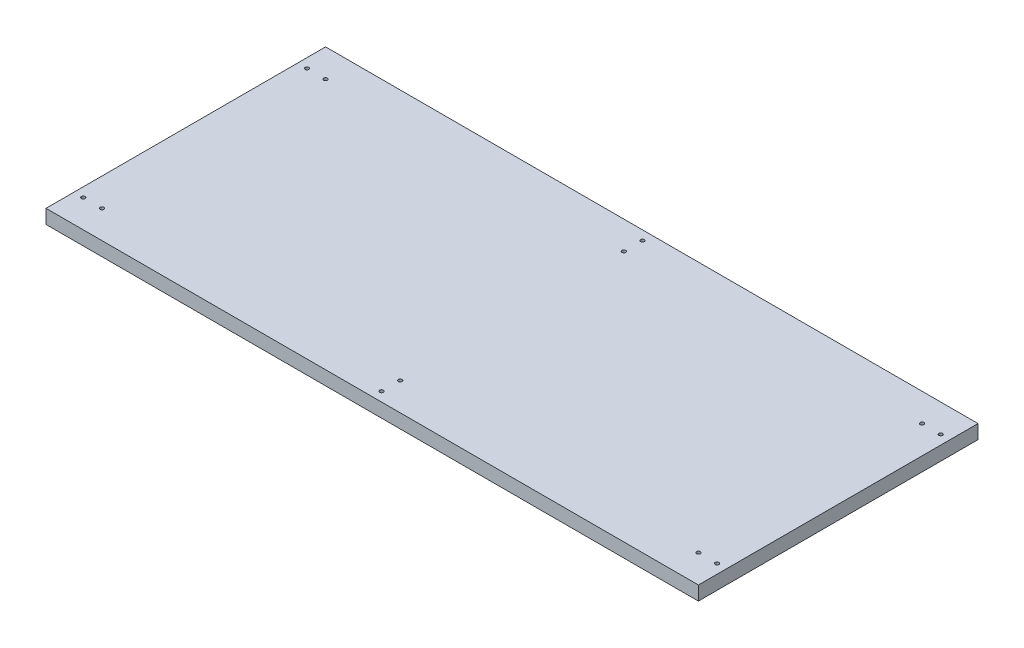
ISO-10303-21;
HEADER;
FILE_DESCRIPTION(('STEP AP214'),'2;1');
FILE_NAME('part.step','',(''),(''),'','','');
FILE_SCHEMA(('AUTOMOTIVE_DESIGN { 1 0 10303 214 1 1 1 1 }'));
ENDSEC;
DATA;
#1=APPLICATION_CONTEXT('core data for automotive mechanical design processes');
#2=APPLICATION_PROTOCOL_DEFINITION('international standard','automotive_design',2000,#1);
#3=PRODUCT_CONTEXT('',#1,'mechanical');
#4=PRODUCT('Part','Part','',(#3));
#5=PRODUCT_RELATED_PRODUCT_CATEGORY('part','',(#4));
#6=PRODUCT_DEFINITION_FORMATION('','',#4);
#7=PRODUCT_DEFINITION_CONTEXT('part definition',#1,'design');
#8=PRODUCT_DEFINITION('design','',#6,#7);
#9=PRODUCT_DEFINITION_SHAPE('','',#8);
#10=(LENGTH_UNIT() NAMED_UNIT(*) SI_UNIT(.MILLI.,.METRE.));
#11=(NAMED_UNIT(*) PLANE_ANGLE_UNIT() SI_UNIT($,.RADIAN.));
#12=(NAMED_UNIT(*) SI_UNIT($,.STERADIAN.) SOLID_ANGLE_UNIT());
#13=UNCERTAINTY_MEASURE_WITH_UNIT(LENGTH_MEASURE(1.E-05),#10,'distance_accuracy_value','');
#14=(GEOMETRIC_REPRESENTATION_CONTEXT(3) GLOBAL_UNCERTAINTY_ASSIGNED_CONTEXT((#13)) GLOBAL_UNIT_ASSIGNED_CONTEXT((#10,
#11,#12)) REPRESENTATION_CONTEXT('',''));
#15=CARTESIAN_POINT('',(0.,0.,0.));
#16=DIRECTION('',(0.,0.,1.));
#17=DIRECTION('',(1.,0.,0.));
#18=AXIS2_PLACEMENT_3D('',#15,#16,#17);
#19=CARTESIAN_POINT('',(350.,15.,150.));
#20=DIRECTION('',(-1.,0.,0.));
#21=DIRECTION('',(0.,0.,1.));
#22=AXIS2_PLACEMENT_3D('',#19,#20,#21);
#23=PLANE('',#22);
#24=DIRECTION('',(0.,0.,-1.));
#25=VECTOR('',#24,1.);
#26=CARTESIAN_POINT('',(350.,0.,150.));
#27=LINE('',#26,#25);
#28=CARTESIAN_POINT('',(350.,0.,150.));
#29=VERTEX_POINT('',#28);
#30=CARTESIAN_POINT('',(350.,0.,-150.));
#31=VERTEX_POINT('',#30);
#32=EDGE_CURVE('E96',#29,#31,#27,.T.);
#33=ORIENTED_EDGE('',*,*,#32,.T.);
#34=DIRECTION('',(0.,-1.,0.));
#35=VECTOR('',#34,1.);
#36=CARTESIAN_POINT('',(350.,15.,-150.));
#37=LINE('',#36,#35);
#38=CARTESIAN_POINT('',(350.,15.,-150.));
#39=VERTEX_POINT('',#38);
#40=EDGE_CURVE('E11',#39,#31,#37,.T.);
#41=ORIENTED_EDGE('',*,*,#40,.F.);
#42=DIRECTION('',(0.,0.,-1.));
#43=VECTOR('',#42,1.);
#44=CARTESIAN_POINT('',(350.,15.,150.));
#45=LINE('',#44,#43);
#46=CARTESIAN_POINT('',(350.,15.,150.));
#47=VERTEX_POINT('',#46);
#48=EDGE_CURVE('E84',#47,#39,#45,.T.);
#49=ORIENTED_EDGE('',*,*,#48,.F.);
#50=DIRECTION('',(0.,-1.,0.));
#51=VECTOR('',#50,1.);
#52=CARTESIAN_POINT('',(350.,15.,150.));
#53=LINE('',#52,#51);
#54=EDGE_CURVE('E92',#47,#29,#53,.T.);
#55=ORIENTED_EDGE('',*,*,#54,.T.);
#56=EDGE_LOOP('',(#33,#41,#49,#55));
#57=FACE_BOUND('',#56,.T.);
#58=ADVANCED_FACE('F33',(#57),#23,.F.);
#59=CARTESIAN_POINT('',(-350.,15.,-150.));
#60=DIRECTION('',(0.,0.,1.));
#61=DIRECTION('',(1.,0.,0.));
#62=AXIS2_PLACEMENT_3D('',#59,#60,#61);
#63=PLANE('',#62);
#64=DIRECTION('',(-1.,0.,0.));
#65=VECTOR('',#64,1.);
#66=CARTESIAN_POINT('',(-350.,0.,-150.));
#67=LINE('',#66,#65);
#68=CARTESIAN_POINT('',(-350.,0.,-150.));
#69=VERTEX_POINT('',#68);
#70=EDGE_CURVE('E88',#31,#69,#67,.T.);
#71=ORIENTED_EDGE('',*,*,#70,.T.);
#72=DIRECTION('',(0.,-1.,0.));
#73=VECTOR('',#72,1.);
#74=CARTESIAN_POINT('',(-350.,15.,-150.));
#75=LINE('',#74,#73);
#76=CARTESIAN_POINT('',(-350.,15.,-150.));
#77=VERTEX_POINT('',#76);
#78=EDGE_CURVE('E41',#77,#69,#75,.T.);
#79=ORIENTED_EDGE('',*,*,#78,.F.);
#80=DIRECTION('',(-1.,0.,0.));
#81=VECTOR('',#80,1.);
#82=CARTESIAN_POINT('',(-350.,15.,-150.));
#83=LINE('',#82,#81);
#84=EDGE_CURVE('E79',#39,#77,#83,.T.);
#85=ORIENTED_EDGE('',*,*,#84,.F.);
#86=ORIENTED_EDGE('',*,*,#40,.T.);
#87=EDGE_LOOP('',(#71,#79,#85,#86));
#88=FACE_BOUND('',#87,.T.);
#89=ADVANCED_FACE('F87',(#88),#63,.F.);
#90=CARTESIAN_POINT('',(-350.,15.,150.));
#91=DIRECTION('',(1.,0.,0.));
#92=DIRECTION('',(0.,0.,-1.));
#93=AXIS2_PLACEMENT_3D('',#90,#91,#92);
#94=PLANE('',#93);
#95=DIRECTION('',(0.,0.,1.));
#96=VECTOR('',#95,1.);
#97=CARTESIAN_POINT('',(-350.,0.,150.));
#98=LINE('',#97,#96);
#99=CARTESIAN_POINT('',(-350.,0.,150.));
#100=VERTEX_POINT('',#99);
#101=EDGE_CURVE('E66',#69,#100,#98,.T.);
#102=ORIENTED_EDGE('',*,*,#101,.T.);
#103=DIRECTION('',(0.,-1.,0.));
#104=VECTOR('',#103,1.);
#105=CARTESIAN_POINT('',(-350.,15.,150.));
#106=LINE('',#105,#104);
#107=CARTESIAN_POINT('',(-350.,15.,150.));
#108=VERTEX_POINT('',#107);
#109=EDGE_CURVE('E89',#108,#100,#106,.T.);
#110=ORIENTED_EDGE('',*,*,#109,.F.);
#111=DIRECTION('',(0.,0.,1.));
#112=VECTOR('',#111,1.);
#113=CARTESIAN_POINT('',(-350.,15.,150.));
#114=LINE('',#113,#112);
#115=EDGE_CURVE('E82',#77,#108,#114,.T.);
#116=ORIENTED_EDGE('',*,*,#115,.F.);
#117=ORIENTED_EDGE('',*,*,#78,.T.);
#118=EDGE_LOOP('',(#102,#110,#116,#117));
#119=FACE_BOUND('',#118,.T.);
#120=ADVANCED_FACE('F90',(#119),#94,.F.);
#121=CARTESIAN_POINT('',(-350.,15.,150.));
#122=DIRECTION('',(0.,0.,-1.));
#123=DIRECTION('',(-1.,0.,0.));
#124=AXIS2_PLACEMENT_3D('',#121,#122,#123);
#125=PLANE('',#124);
#126=DIRECTION('',(1.,0.,0.));
#127=VECTOR('',#126,1.);
#128=CARTESIAN_POINT('',(-350.,0.,150.));
#129=LINE('',#128,#127);
#130=EDGE_CURVE('E72',#100,#29,#129,.T.);
#131=ORIENTED_EDGE('',*,*,#130,.T.);
#132=ORIENTED_EDGE('',*,*,#54,.F.);
#133=DIRECTION('',(1.,0.,0.));
#134=VECTOR('',#133,1.);
#135=CARTESIAN_POINT('',(-350.,15.,150.));
#136=LINE('',#135,#134);
#137=EDGE_CURVE('E49',#108,#47,#136,.T.);
#138=ORIENTED_EDGE('',*,*,#137,.F.);
#139=ORIENTED_EDGE('',*,*,#109,.T.);
#140=EDGE_LOOP('',(#131,#132,#138,#139));
#141=FACE_BOUND('',#140,.T.);
#142=ADVANCED_FACE('F104',(#141),#125,.F.);
#143=CARTESIAN_POINT('',(0.,15.,0.));
#144=DIRECTION('',(0.,-1.,0.));
#145=DIRECTION('',(0.,0.,-1.));
#146=AXIS2_PLACEMENT_3D('',#143,#144,#145);
#147=PLANE('',#146);
#148=CARTESIAN_POINT('',(340.,15.,-120.));
#149=DIRECTION('',(0.,1.,0.));
#150=DIRECTION('',(0.,0.,1.));
#151=AXIS2_PLACEMENT_3D('',#148,#149,#150);
#152=CIRCLE('',#151,2.);
#153=CARTESIAN_POINT('',(340.,15.,-118.));
#154=VERTEX_POINT('',#153);
#155=EDGE_CURVE('E176',#154,#154,#152,.T.);
#156=ORIENTED_EDGE('',*,*,#155,.F.);
#157=EDGE_LOOP('',(#156));
#158=FACE_BOUND('',#157,.T.);
#159=CARTESIAN_POINT('',(340.,15.,120.));
#160=DIRECTION('',(0.,1.,0.));
#161=DIRECTION('',(0.,0.,1.));
#162=AXIS2_PLACEMENT_3D('',#159,#160,#161);
#163=CIRCLE('',#162,2.);
#164=CARTESIAN_POINT('',(340.,15.,122.));
#165=VERTEX_POINT('',#164);
#166=EDGE_CURVE('E170',#165,#165,#163,.T.);
#167=ORIENTED_EDGE('',*,*,#166,.F.);
#168=EDGE_LOOP('',(#167));
#169=FACE_BOUND('',#168,.T.);
#170=CARTESIAN_POINT('',(0.,15.,-140.));
#171=DIRECTION('',(0.,1.,0.));
#172=DIRECTION('',(0.,0.,1.));
#173=AXIS2_PLACEMENT_3D('',#170,#171,#172);
#174=CIRCLE('',#173,2.);
#175=CARTESIAN_POINT('',(0.,15.,-138.));
#176=VERTEX_POINT('',#175);
#177=EDGE_CURVE('E164',#176,#176,#174,.T.);
#178=ORIENTED_EDGE('',*,*,#177,.F.);
#179=EDGE_LOOP('',(#178));
#180=FACE_BOUND('',#179,.T.);
#181=CARTESIAN_POINT('',(0.,15.,140.));
#182=DIRECTION('',(0.,1.,0.));
#183=DIRECTION('',(0.,0.,1.));
#184=AXIS2_PLACEMENT_3D('',#181,#182,#183);
#185=CIRCLE('',#184,2.);
#186=CARTESIAN_POINT('',(0.,15.,142.));
#187=VERTEX_POINT('',#186);
#188=EDGE_CURVE('E158',#187,#187,#185,.T.);
#189=ORIENTED_EDGE('',*,*,#188,.F.);
#190=EDGE_LOOP('',(#189));
#191=FACE_BOUND('',#190,.T.);
#192=CARTESIAN_POINT('',(-340.,15.,-120.));
#193=DIRECTION('',(0.,1.,0.));
#194=DIRECTION('',(0.,0.,1.));
#195=AXIS2_PLACEMENT_3D('',#192,#193,#194);
#196=CIRCLE('',#195,2.);
#197=CARTESIAN_POINT('',(-340.,15.,-118.));
#198=VERTEX_POINT('',#197);
#199=EDGE_CURVE('E152',#198,#198,#196,.T.);
#200=ORIENTED_EDGE('',*,*,#199,.F.);
#201=EDGE_LOOP('',(#200));
#202=FACE_BOUND('',#201,.T.);
#203=CARTESIAN_POINT('',(-340.,15.,120.));
#204=DIRECTION('',(0.,1.,0.));
#205=DIRECTION('',(0.,0.,1.));
#206=AXIS2_PLACEMENT_3D('',#203,#204,#205);
#207=CIRCLE('',#206,2.);
#208=CARTESIAN_POINT('',(-340.,15.,122.));
#209=VERTEX_POINT('',#208);
#210=EDGE_CURVE('E146',#209,#209,#207,.T.);
#211=ORIENTED_EDGE('',*,*,#210,.F.);
#212=EDGE_LOOP('',(#211));
#213=FACE_BOUND('',#212,.T.);
#214=CARTESIAN_POINT('',(0.,15.,-120.));
#215=DIRECTION('',(0.,1.,0.));
#216=DIRECTION('',(0.,0.,1.));
#217=AXIS2_PLACEMENT_3D('',#214,#215,#216);
#218=CIRCLE('',#217,2.);
#219=CARTESIAN_POINT('',(0.,15.,-118.));
#220=VERTEX_POINT('',#219);
#221=EDGE_CURVE('E140',#220,#220,#218,.T.);
#222=ORIENTED_EDGE('',*,*,#221,.F.);
#223=EDGE_LOOP('',(#222));
#224=FACE_BOUND('',#223,.T.);
#225=CARTESIAN_POINT('',(0.,15.,120.));
#226=DIRECTION('',(0.,1.,0.));
#227=DIRECTION('',(0.,0.,1.));
#228=AXIS2_PLACEMENT_3D('',#225,#226,#227);
#229=CIRCLE('',#228,2.);
#230=CARTESIAN_POINT('',(0.,15.,122.));
#231=VERTEX_POINT('',#230);
#232=EDGE_CURVE('E134',#231,#231,#229,.T.);
#233=ORIENTED_EDGE('',*,*,#232,.F.);
#234=EDGE_LOOP('',(#233));
#235=FACE_BOUND('',#234,.T.);
#236=CARTESIAN_POINT('',(320.,15.,120.));
#237=DIRECTION('',(0.,1.,0.));
#238=DIRECTION('',(0.,0.,1.));
#239=AXIS2_PLACEMENT_3D('',#236,#237,#238);
#240=CIRCLE('',#239,2.);
#241=CARTESIAN_POINT('',(320.,15.,122.));
#242=VERTEX_POINT('',#241);
#243=EDGE_CURVE('E128',#242,#242,#240,.T.);
#244=ORIENTED_EDGE('',*,*,#243,.F.);
#245=EDGE_LOOP('',(#244));
#246=FACE_BOUND('',#245,.T.);
#247=CARTESIAN_POINT('',(320.,15.,-120.));
#248=DIRECTION('',(0.,1.,0.));
#249=DIRECTION('',(0.,0.,1.));
#250=AXIS2_PLACEMENT_3D('',#247,#248,#249);
#251=CIRCLE('',#250,2.);
#252=CARTESIAN_POINT('',(320.,15.,-118.));
#253=VERTEX_POINT('',#252);
#254=EDGE_CURVE('E122',#253,#253,#251,.T.);
#255=ORIENTED_EDGE('',*,*,#254,.F.);
#256=EDGE_LOOP('',(#255));
#257=FACE_BOUND('',#256,.T.);
#258=CARTESIAN_POINT('',(-320.,15.,120.));
#259=DIRECTION('',(0.,1.,0.));
#260=DIRECTION('',(0.,0.,1.));
#261=AXIS2_PLACEMENT_3D('',#258,#259,#260);
#262=CIRCLE('',#261,2.);
#263=CARTESIAN_POINT('',(-320.,15.,122.));
#264=VERTEX_POINT('',#263);
#265=EDGE_CURVE('E116',#264,#264,#262,.T.);
#266=ORIENTED_EDGE('',*,*,#265,.F.);
#267=EDGE_LOOP('',(#266));
#268=FACE_BOUND('',#267,.T.);
#269=CARTESIAN_POINT('',(-320.,15.,-120.));
#270=DIRECTION('',(0.,1.,0.));
#271=DIRECTION('',(0.,0.,1.));
#272=AXIS2_PLACEMENT_3D('',#269,#270,#271);
#273=CIRCLE('',#272,2.);
#274=CARTESIAN_POINT('',(-320.,15.,-118.));
#275=VERTEX_POINT('',#274);
#276=EDGE_CURVE('E110',#275,#275,#273,.T.);
#277=ORIENTED_EDGE('',*,*,#276,.F.);
#278=EDGE_LOOP('',(#277));
#279=FACE_BOUND('',#278,.T.);
#280=ORIENTED_EDGE('',*,*,#48,.T.);
#281=ORIENTED_EDGE('',*,*,#84,.T.);
#282=ORIENTED_EDGE('',*,*,#115,.T.);
#283=ORIENTED_EDGE('',*,*,#137,.T.);
#284=EDGE_LOOP('',(#280,#281,#282,#283));
#285=FACE_BOUND('',#284,.T.);
#286=ADVANCED_FACE('F80',(#158,#169,#180,#191,#202,#213,#224,#235,#246,#257,#268,#279,#285),
#147,.F.);
#287=CARTESIAN_POINT('',(0.,0.,0.));
#288=DIRECTION('',(0.,-1.,0.));
#289=DIRECTION('',(0.,0.,-1.));
#290=AXIS2_PLACEMENT_3D('',#287,#288,#289);
#291=PLANE('',#290);
#292=ORIENTED_EDGE('',*,*,#32,.F.);
#293=ORIENTED_EDGE('',*,*,#130,.F.);
#294=ORIENTED_EDGE('',*,*,#101,.F.);
#295=ORIENTED_EDGE('',*,*,#70,.F.);
#296=EDGE_LOOP('',(#292,#293,#294,#295));
#297=FACE_BOUND('',#296,.T.);
#298=ADVANCED_FACE('F107',(#297),#291,.T.);
#299=CARTESIAN_POINT('',(-320.,5.,-120.));
#300=DIRECTION('',(0.,1.,0.));
#301=DIRECTION('',(0.,0.,1.));
#302=AXIS2_PLACEMENT_3D('',#299,#300,#301);
#303=CYLINDRICAL_SURFACE('',#302,2.);
#304=CARTESIAN_POINT('',(-320.,5.,-120.));
#305=DIRECTION('',(0.,1.,0.));
#306=DIRECTION('',(0.,0.,1.));
#307=AXIS2_PLACEMENT_3D('',#304,#305,#306);
#308=CIRCLE('',#307,2.);
#309=CARTESIAN_POINT('',(-320.,5.,-118.));
#310=VERTEX_POINT('',#309);
#311=EDGE_CURVE('E99',#310,#310,#308,.T.);
#312=ORIENTED_EDGE('',*,*,#311,.F.);
#313=EDGE_LOOP('',(#312));
#314=FACE_BOUND('',#313,.T.);
#315=ORIENTED_EDGE('',*,*,#276,.T.);
#316=EDGE_LOOP('',(#315));
#317=FACE_BOUND('',#316,.T.);
#318=ADVANCED_FACE('F216',(#314,#317),#303,.F.);
#319=CARTESIAN_POINT('',(-320.,5.,-120.));
#320=DIRECTION('',(0.,1.,0.));
#321=DIRECTION('',(0.,0.,1.));
#322=AXIS2_PLACEMENT_3D('',#319,#320,#321);
#323=PLANE('',#322);
#324=ORIENTED_EDGE('',*,*,#311,.T.);
#325=EDGE_LOOP('',(#324));
#326=FACE_BOUND('',#325,.T.);
#327=ADVANCED_FACE('F218',(#326),#323,.T.);
#328=CARTESIAN_POINT('',(-320.,5.,120.));
#329=DIRECTION('',(0.,1.,0.));
#330=DIRECTION('',(0.,0.,1.));
#331=AXIS2_PLACEMENT_3D('',#328,#329,#330);
#332=CYLINDRICAL_SURFACE('',#331,2.);
#333=CARTESIAN_POINT('',(-320.,5.,120.));
#334=DIRECTION('',(0.,1.,0.));
#335=DIRECTION('',(0.,0.,1.));
#336=AXIS2_PLACEMENT_3D('',#333,#334,#335);
#337=CIRCLE('',#336,2.);
#338=CARTESIAN_POINT('',(-320.,5.,122.));
#339=VERTEX_POINT('',#338);
#340=EDGE_CURVE('E113',#339,#339,#337,.T.);
#341=ORIENTED_EDGE('',*,*,#340,.F.);
#342=EDGE_LOOP('',(#341));
#343=FACE_BOUND('',#342,.T.);
#344=ORIENTED_EDGE('',*,*,#265,.T.);
#345=EDGE_LOOP('',(#344));
#346=FACE_BOUND('',#345,.T.);
#347=ADVANCED_FACE('F225',(#343,#346),#332,.F.);
#348=CARTESIAN_POINT('',(-320.,5.,120.));
#349=DIRECTION('',(0.,1.,0.));
#350=DIRECTION('',(0.,0.,1.));
#351=AXIS2_PLACEMENT_3D('',#348,#349,#350);
#352=PLANE('',#351);
#353=ORIENTED_EDGE('',*,*,#340,.T.);
#354=EDGE_LOOP('',(#353));
#355=FACE_BOUND('',#354,.T.);
#356=ADVANCED_FACE('F273',(#355),#352,.T.);
#357=CARTESIAN_POINT('',(320.,5.,-120.));
#358=DIRECTION('',(0.,1.,0.));
#359=DIRECTION('',(0.,0.,1.));
#360=AXIS2_PLACEMENT_3D('',#357,#358,#359);
#361=CYLINDRICAL_SURFACE('',#360,2.);
#362=CARTESIAN_POINT('',(320.,5.,-120.));
#363=DIRECTION('',(0.,1.,0.));
#364=DIRECTION('',(0.,0.,1.));
#365=AXIS2_PLACEMENT_3D('',#362,#363,#364);
#366=CIRCLE('',#365,2.);
#367=CARTESIAN_POINT('',(320.,5.,-118.));
#368=VERTEX_POINT('',#367);
#369=EDGE_CURVE('E119',#368,#368,#366,.T.);
#370=ORIENTED_EDGE('',*,*,#369,.F.);
#371=EDGE_LOOP('',(#370));
#372=FACE_BOUND('',#371,.T.);
#373=ORIENTED_EDGE('',*,*,#254,.T.);
#374=EDGE_LOOP('',(#373));
#375=FACE_BOUND('',#374,.T.);
#376=ADVANCED_FACE('F282',(#372,#375),#361,.F.);
#377=CARTESIAN_POINT('',(320.,5.,-120.));
#378=DIRECTION('',(0.,1.,0.));
#379=DIRECTION('',(0.,0.,1.));
#380=AXIS2_PLACEMENT_3D('',#377,#378,#379);
#381=PLANE('',#380);
#382=ORIENTED_EDGE('',*,*,#369,.T.);
#383=EDGE_LOOP('',(#382));
#384=FACE_BOUND('',#383,.T.);
#385=ADVANCED_FACE('F291',(#384),#381,.T.);
#386=CARTESIAN_POINT('',(320.,5.,120.));
#387=DIRECTION('',(0.,1.,0.));
#388=DIRECTION('',(0.,0.,1.));
#389=AXIS2_PLACEMENT_3D('',#386,#387,#388);
#390=CYLINDRICAL_SURFACE('',#389,2.);
#391=CARTESIAN_POINT('',(320.,5.,120.));
#392=DIRECTION('',(0.,1.,0.));
#393=DIRECTION('',(0.,0.,1.));
#394=AXIS2_PLACEMENT_3D('',#391,#392,#393);
#395=CIRCLE('',#394,2.);
#396=CARTESIAN_POINT('',(320.,5.,122.));
#397=VERTEX_POINT('',#396);
#398=EDGE_CURVE('E125',#397,#397,#395,.T.);
#399=ORIENTED_EDGE('',*,*,#398,.F.);
#400=EDGE_LOOP('',(#399));
#401=FACE_BOUND('',#400,.T.);
#402=ORIENTED_EDGE('',*,*,#243,.T.);
#403=EDGE_LOOP('',(#402));
#404=FACE_BOUND('',#403,.T.);
#405=ADVANCED_FACE('F300',(#401,#404),#390,.F.);
#406=CARTESIAN_POINT('',(320.,5.,120.));
#407=DIRECTION('',(0.,1.,0.));
#408=DIRECTION('',(0.,0.,1.));
#409=AXIS2_PLACEMENT_3D('',#406,#407,#408);
#410=PLANE('',#409);
#411=ORIENTED_EDGE('',*,*,#398,.T.);
#412=EDGE_LOOP('',(#411));
#413=FACE_BOUND('',#412,.T.);
#414=ADVANCED_FACE('F309',(#413),#410,.T.);
#415=CARTESIAN_POINT('',(0.,5.,120.));
#416=DIRECTION('',(0.,1.,0.));
#417=DIRECTION('',(0.,0.,1.));
#418=AXIS2_PLACEMENT_3D('',#415,#416,#417);
#419=CYLINDRICAL_SURFACE('',#418,2.);
#420=CARTESIAN_POINT('',(0.,5.,120.));
#421=DIRECTION('',(0.,1.,0.));
#422=DIRECTION('',(0.,0.,1.));
#423=AXIS2_PLACEMENT_3D('',#420,#421,#422);
#424=CIRCLE('',#423,2.);
#425=CARTESIAN_POINT('',(0.,5.,122.));
#426=VERTEX_POINT('',#425);
#427=EDGE_CURVE('E131',#426,#426,#424,.T.);
#428=ORIENTED_EDGE('',*,*,#427,.F.);
#429=EDGE_LOOP('',(#428));
#430=FACE_BOUND('',#429,.T.);
#431=ORIENTED_EDGE('',*,*,#232,.T.);
#432=EDGE_LOOP('',(#431));
#433=FACE_BOUND('',#432,.T.);
#434=ADVANCED_FACE('F318',(#430,#433),#419,.F.);
#435=CARTESIAN_POINT('',(0.,5.,120.));
#436=DIRECTION('',(0.,1.,0.));
#437=DIRECTION('',(0.,0.,1.));
#438=AXIS2_PLACEMENT_3D('',#435,#436,#437);
#439=PLANE('',#438);
#440=ORIENTED_EDGE('',*,*,#427,.T.);
#441=EDGE_LOOP('',(#440));
#442=FACE_BOUND('',#441,.T.);
#443=ADVANCED_FACE('F327',(#442),#439,.T.);
#444=CARTESIAN_POINT('',(0.,5.,-120.));
#445=DIRECTION('',(0.,1.,0.));
#446=DIRECTION('',(0.,0.,1.));
#447=AXIS2_PLACEMENT_3D('',#444,#445,#446);
#448=CYLINDRICAL_SURFACE('',#447,2.);
#449=CARTESIAN_POINT('',(0.,5.,-120.));
#450=DIRECTION('',(0.,1.,0.));
#451=DIRECTION('',(0.,0.,1.));
#452=AXIS2_PLACEMENT_3D('',#449,#450,#451);
#453=CIRCLE('',#452,2.);
#454=CARTESIAN_POINT('',(0.,5.,-118.));
#455=VERTEX_POINT('',#454);
#456=EDGE_CURVE('E137',#455,#455,#453,.T.);
#457=ORIENTED_EDGE('',*,*,#456,.F.);
#458=EDGE_LOOP('',(#457));
#459=FACE_BOUND('',#458,.T.);
#460=ORIENTED_EDGE('',*,*,#221,.T.);
#461=EDGE_LOOP('',(#460));
#462=FACE_BOUND('',#461,.T.);
#463=ADVANCED_FACE('F336',(#459,#462),#448,.F.);
#464=CARTESIAN_POINT('',(0.,5.,-120.));
#465=DIRECTION('',(0.,1.,0.));
#466=DIRECTION('',(0.,0.,1.));
#467=AXIS2_PLACEMENT_3D('',#464,#465,#466);
#468=PLANE('',#467);
#469=ORIENTED_EDGE('',*,*,#456,.T.);
#470=EDGE_LOOP('',(#469));
#471=FACE_BOUND('',#470,.T.);
#472=ADVANCED_FACE('F345',(#471),#468,.T.);
#473=CARTESIAN_POINT('',(-340.,5.,120.));
#474=DIRECTION('',(0.,1.,0.));
#475=DIRECTION('',(0.,0.,1.));
#476=AXIS2_PLACEMENT_3D('',#473,#474,#475);
#477=CYLINDRICAL_SURFACE('',#476,2.);
#478=CARTESIAN_POINT('',(-340.,5.,120.));
#479=DIRECTION('',(0.,1.,0.));
#480=DIRECTION('',(0.,0.,1.));
#481=AXIS2_PLACEMENT_3D('',#478,#479,#480);
#482=CIRCLE('',#481,2.);
#483=CARTESIAN_POINT('',(-340.,5.,122.));
#484=VERTEX_POINT('',#483);
#485=EDGE_CURVE('E143',#484,#484,#482,.T.);
#486=ORIENTED_EDGE('',*,*,#485,.F.);
#487=EDGE_LOOP('',(#486));
#488=FACE_BOUND('',#487,.T.);
#489=ORIENTED_EDGE('',*,*,#210,.T.);
#490=EDGE_LOOP('',(#489));
#491=FACE_BOUND('',#490,.T.);
#492=ADVANCED_FACE('F354',(#488,#491),#477,.F.);
#493=CARTESIAN_POINT('',(-340.,5.,120.));
#494=DIRECTION('',(0.,1.,0.));
#495=DIRECTION('',(0.,0.,1.));
#496=AXIS2_PLACEMENT_3D('',#493,#494,#495);
#497=PLANE('',#496);
#498=ORIENTED_EDGE('',*,*,#485,.T.);
#499=EDGE_LOOP('',(#498));
#500=FACE_BOUND('',#499,.T.);
#501=ADVANCED_FACE('F363',(#500),#497,.T.);
#502=CARTESIAN_POINT('',(-340.,5.,-120.));
#503=DIRECTION('',(0.,1.,0.));
#504=DIRECTION('',(0.,0.,1.));
#505=AXIS2_PLACEMENT_3D('',#502,#503,#504);
#506=CYLINDRICAL_SURFACE('',#505,2.);
#507=CARTESIAN_POINT('',(-340.,5.,-120.));
#508=DIRECTION('',(0.,1.,0.));
#509=DIRECTION('',(0.,0.,1.));
#510=AXIS2_PLACEMENT_3D('',#507,#508,#509);
#511=CIRCLE('',#510,2.);
#512=CARTESIAN_POINT('',(-340.,5.,-118.));
#513=VERTEX_POINT('',#512);
#514=EDGE_CURVE('E149',#513,#513,#511,.T.);
#515=ORIENTED_EDGE('',*,*,#514,.F.);
#516=EDGE_LOOP('',(#515));
#517=FACE_BOUND('',#516,.T.);
#518=ORIENTED_EDGE('',*,*,#199,.T.);
#519=EDGE_LOOP('',(#518));
#520=FACE_BOUND('',#519,.T.);
#521=ADVANCED_FACE('F372',(#517,#520),#506,.F.);
#522=CARTESIAN_POINT('',(-340.,5.,-120.));
#523=DIRECTION('',(0.,1.,0.));
#524=DIRECTION('',(0.,0.,1.));
#525=AXIS2_PLACEMENT_3D('',#522,#523,#524);
#526=PLANE('',#525);
#527=ORIENTED_EDGE('',*,*,#514,.T.);
#528=EDGE_LOOP('',(#527));
#529=FACE_BOUND('',#528,.T.);
#530=ADVANCED_FACE('F381',(#529),#526,.T.);
#531=CARTESIAN_POINT('',(0.,5.,140.));
#532=DIRECTION('',(0.,1.,0.));
#533=DIRECTION('',(0.,0.,1.));
#534=AXIS2_PLACEMENT_3D('',#531,#532,#533);
#535=CYLINDRICAL_SURFACE('',#534,2.);
#536=CARTESIAN_POINT('',(0.,5.,140.));
#537=DIRECTION('',(0.,1.,0.));
#538=DIRECTION('',(0.,0.,1.));
#539=AXIS2_PLACEMENT_3D('',#536,#537,#538);
#540=CIRCLE('',#539,2.);
#541=CARTESIAN_POINT('',(0.,5.,142.));
#542=VERTEX_POINT('',#541);
#543=EDGE_CURVE('E155',#542,#542,#540,.T.);
#544=ORIENTED_EDGE('',*,*,#543,.F.);
#545=EDGE_LOOP('',(#544));
#546=FACE_BOUND('',#545,.T.);
#547=ORIENTED_EDGE('',*,*,#188,.T.);
#548=EDGE_LOOP('',(#547));
#549=FACE_BOUND('',#548,.T.);
#550=ADVANCED_FACE('F390',(#546,#549),#535,.F.);
#551=CARTESIAN_POINT('',(0.,5.,140.));
#552=DIRECTION('',(0.,1.,0.));
#553=DIRECTION('',(0.,0.,1.));
#554=AXIS2_PLACEMENT_3D('',#551,#552,#553);
#555=PLANE('',#554);
#556=ORIENTED_EDGE('',*,*,#543,.T.);
#557=EDGE_LOOP('',(#556));
#558=FACE_BOUND('',#557,.T.);
#559=ADVANCED_FACE('F399',(#558),#555,.T.);
#560=CARTESIAN_POINT('',(0.,5.,-140.));
#561=DIRECTION('',(0.,1.,0.));
#562=DIRECTION('',(0.,0.,1.));
#563=AXIS2_PLACEMENT_3D('',#560,#561,#562);
#564=CYLINDRICAL_SURFACE('',#563,2.);
#565=CARTESIAN_POINT('',(0.,5.,-140.));
#566=DIRECTION('',(0.,1.,0.));
#567=DIRECTION('',(0.,0.,1.));
#568=AXIS2_PLACEMENT_3D('',#565,#566,#567);
#569=CIRCLE('',#568,2.);
#570=CARTESIAN_POINT('',(0.,5.,-138.));
#571=VERTEX_POINT('',#570);
#572=EDGE_CURVE('E161',#571,#571,#569,.T.);
#573=ORIENTED_EDGE('',*,*,#572,.F.);
#574=EDGE_LOOP('',(#573));
#575=FACE_BOUND('',#574,.T.);
#576=ORIENTED_EDGE('',*,*,#177,.T.);
#577=EDGE_LOOP('',(#576));
#578=FACE_BOUND('',#577,.T.);
#579=ADVANCED_FACE('F408',(#575,#578),#564,.F.);
#580=CARTESIAN_POINT('',(0.,5.,-140.));
#581=DIRECTION('',(0.,1.,0.));
#582=DIRECTION('',(0.,0.,1.));
#583=AXIS2_PLACEMENT_3D('',#580,#581,#582);
#584=PLANE('',#583);
#585=ORIENTED_EDGE('',*,*,#572,.T.);
#586=EDGE_LOOP('',(#585));
#587=FACE_BOUND('',#586,.T.);
#588=ADVANCED_FACE('F417',(#587),#584,.T.);
#589=CARTESIAN_POINT('',(340.,5.,120.));
#590=DIRECTION('',(0.,1.,0.));
#591=DIRECTION('',(0.,0.,1.));
#592=AXIS2_PLACEMENT_3D('',#589,#590,#591);
#593=CYLINDRICAL_SURFACE('',#592,2.);
#594=CARTESIAN_POINT('',(340.,5.,120.));
#595=DIRECTION('',(0.,1.,0.));
#596=DIRECTION('',(0.,0.,1.));
#597=AXIS2_PLACEMENT_3D('',#594,#595,#596);
#598=CIRCLE('',#597,2.);
#599=CARTESIAN_POINT('',(340.,5.,122.));
#600=VERTEX_POINT('',#599);
#601=EDGE_CURVE('E167',#600,#600,#598,.T.);
#602=ORIENTED_EDGE('',*,*,#601,.F.);
#603=EDGE_LOOP('',(#602));
#604=FACE_BOUND('',#603,.T.);
#605=ORIENTED_EDGE('',*,*,#166,.T.);
#606=EDGE_LOOP('',(#605));
#607=FACE_BOUND('',#606,.T.);
#608=ADVANCED_FACE('F426',(#604,#607),#593,.F.);
#609=CARTESIAN_POINT('',(340.,5.,120.));
#610=DIRECTION('',(0.,1.,0.));
#611=DIRECTION('',(0.,0.,1.));
#612=AXIS2_PLACEMENT_3D('',#609,#610,#611);
#613=PLANE('',#612);
#614=ORIENTED_EDGE('',*,*,#601,.T.);
#615=EDGE_LOOP('',(#614));
#616=FACE_BOUND('',#615,.T.);
#617=ADVANCED_FACE('F187',(#616),#613,.T.);
#618=CARTESIAN_POINT('',(340.,5.,-120.));
#619=DIRECTION('',(0.,1.,0.));
#620=DIRECTION('',(0.,0.,1.));
#621=AXIS2_PLACEMENT_3D('',#618,#619,#620);
#622=CYLINDRICAL_SURFACE('',#621,2.);
#623=CARTESIAN_POINT('',(340.,5.,-120.));
#624=DIRECTION('',(0.,1.,0.));
#625=DIRECTION('',(0.,0.,1.));
#626=AXIS2_PLACEMENT_3D('',#623,#624,#625);
#627=CIRCLE('',#626,2.);
#628=CARTESIAN_POINT('',(340.,5.,-118.));
#629=VERTEX_POINT('',#628);
#630=EDGE_CURVE('E173',#629,#629,#627,.T.);
#631=ORIENTED_EDGE('',*,*,#630,.F.);
#632=EDGE_LOOP('',(#631));
#633=FACE_BOUND('',#632,.T.);
#634=ORIENTED_EDGE('',*,*,#155,.T.);
#635=EDGE_LOOP('',(#634));
#636=FACE_BOUND('',#635,.T.);
#637=ADVANCED_FACE('F184',(#633,#636),#622,.F.);
#638=CARTESIAN_POINT('',(340.,5.,-120.));
#639=DIRECTION('',(0.,1.,0.));
#640=DIRECTION('',(0.,0.,1.));
#641=AXIS2_PLACEMENT_3D('',#638,#639,#640);
#642=PLANE('',#641);
#643=ORIENTED_EDGE('',*,*,#630,.T.);
#644=EDGE_LOOP('',(#643));
#645=FACE_BOUND('',#644,.T.);
#646=ADVANCED_FACE('F182',(#645),#642,.T.);
#647=CLOSED_SHELL('',(#58,#89,#120,#142,#286,#298,#318,#327,#347,#356,#376,#385,#405,#414,#434,
#443,#463,#472,#492,#501,#521,#530,#550,#559,#579,#588,#608,#617,#637,#646));
#648=MANIFOLD_SOLID_BREP('B2',#647);
#649=ADVANCED_BREP_SHAPE_REPRESENTATION('',(#18,#648),#14);
#650=SHAPE_DEFINITION_REPRESENTATION(#9,#649);
ENDSEC;
END-ISO-10303-21;
